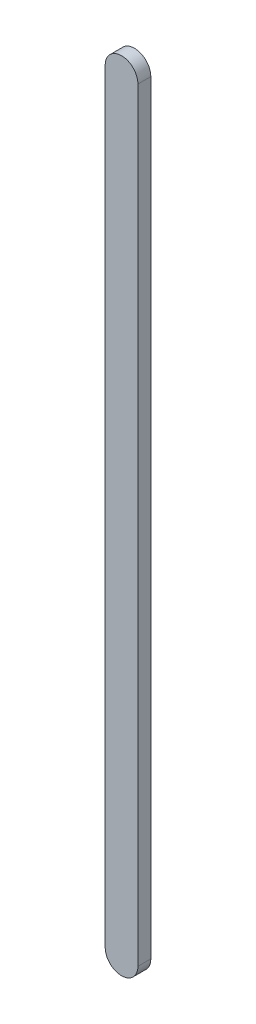
ISO-10303-21;
HEADER;
FILE_DESCRIPTION(('STEP AP214'),'2;1');
FILE_NAME('part.step','',(''),(''),'','','');
FILE_SCHEMA(('AUTOMOTIVE_DESIGN { 1 0 10303 214 1 1 1 1 }'));
ENDSEC;
DATA;
#1=APPLICATION_CONTEXT('core data for automotive mechanical design processes');
#2=APPLICATION_PROTOCOL_DEFINITION('international standard','automotive_design',2000,#1);
#3=PRODUCT_CONTEXT('',#1,'mechanical');
#4=PRODUCT('Part','Part','',(#3));
#5=PRODUCT_RELATED_PRODUCT_CATEGORY('part','',(#4));
#6=PRODUCT_DEFINITION_FORMATION('','',#4);
#7=PRODUCT_DEFINITION_CONTEXT('part definition',#1,'design');
#8=PRODUCT_DEFINITION('design','',#6,#7);
#9=PRODUCT_DEFINITION_SHAPE('','',#8);
#10=(LENGTH_UNIT() NAMED_UNIT(*) SI_UNIT(.MILLI.,.METRE.));
#11=(NAMED_UNIT(*) PLANE_ANGLE_UNIT() SI_UNIT($,.RADIAN.));
#12=(NAMED_UNIT(*) SI_UNIT($,.STERADIAN.) SOLID_ANGLE_UNIT());
#13=UNCERTAINTY_MEASURE_WITH_UNIT(LENGTH_MEASURE(1.E-05),#10,'distance_accuracy_value','');
#14=(GEOMETRIC_REPRESENTATION_CONTEXT(3) GLOBAL_UNCERTAINTY_ASSIGNED_CONTEXT((#13)) GLOBAL_UNIT_ASSIGNED_CONTEXT((#10,
#11,#12)) REPRESENTATION_CONTEXT('',''));
#15=CARTESIAN_POINT('',(0.,0.,0.));
#16=DIRECTION('',(0.,0.,1.));
#17=DIRECTION('',(1.,0.,0.));
#18=AXIS2_PLACEMENT_3D('',#15,#16,#17);
#19=CARTESIAN_POINT('',(143.51,85.3948,0.));
#20=DIRECTION('',(-1.,0.,0.));
#21=DIRECTION('',(0.,1.,0.));
#22=AXIS2_PLACEMENT_3D('',#19,#20,#21);
#23=PLANE('',#22);
#24=DIRECTION('',(0.,1.,0.));
#25=VECTOR('',#24,1.);
#26=CARTESIAN_POINT('',(143.51,85.3948,0.1999996));
#27=LINE('',#26,#25);
#28=CARTESIAN_POINT('',(143.51,85.3948,0.1999996));
#29=VERTEX_POINT('',#28);
#30=CARTESIAN_POINT('',(143.51,97.2519264,0.1999996));
#31=VERTEX_POINT('',#30);
#32=EDGE_CURVE('E11',#29,#31,#27,.T.);
#33=ORIENTED_EDGE('',*,*,#32,.F.);
#34=DIRECTION('',(0.,0.,1.));
#35=VECTOR('',#34,1.);
#36=CARTESIAN_POINT('',(143.51,85.3948,0.));
#37=LINE('',#36,#35);
#38=CARTESIAN_POINT('',(143.51,85.3948,0.));
#39=VERTEX_POINT('',#38);
#40=EDGE_CURVE('E24',#39,#29,#37,.T.);
#41=ORIENTED_EDGE('',*,*,#40,.F.);
#42=DIRECTION('',(0.,1.,0.));
#43=VECTOR('',#42,1.);
#44=CARTESIAN_POINT('',(143.51,85.3948,0.));
#45=LINE('',#44,#43);
#46=CARTESIAN_POINT('',(143.51,97.2519264,0.));
#47=VERTEX_POINT('',#46);
#48=EDGE_CURVE('E75',#39,#47,#45,.T.);
#49=ORIENTED_EDGE('',*,*,#48,.T.);
#50=DIRECTION('',(0.,0.,1.));
#51=VECTOR('',#50,1.);
#52=CARTESIAN_POINT('',(143.51,97.2519264,0.));
#53=LINE('',#52,#51);
#54=EDGE_CURVE('E37',#47,#31,#53,.T.);
#55=ORIENTED_EDGE('',*,*,#54,.T.);
#56=EDGE_LOOP('',(#33,#41,#49,#55));
#57=FACE_BOUND('',#56,.T.);
#58=ADVANCED_FACE('F17',(#57),#23,.F.);
#59=CARTESIAN_POINT('',(143.256,97.2519264,0.));
#60=DIRECTION('',(0.,0.,-1.));
#61=DIRECTION('',(1.,0.,0.));
#62=AXIS2_PLACEMENT_3D('',#59,#60,#61);
#63=CYLINDRICAL_SURFACE('',#62,0.253999999999986);
#64=CARTESIAN_POINT('',(143.256,97.2519264,0.1999996));
#65=DIRECTION('',(0.,0.,1.));
#66=DIRECTION('',(1.,0.,0.));
#67=AXIS2_PLACEMENT_3D('',#64,#65,#66);
#68=CIRCLE('',#67,0.253999999999986);
#69=CARTESIAN_POINT('',(143.002,97.2519264,0.1999996));
#70=VERTEX_POINT('',#69);
#71=EDGE_CURVE('E83',#31,#70,#68,.T.);
#72=ORIENTED_EDGE('',*,*,#71,.F.);
#73=ORIENTED_EDGE('',*,*,#54,.F.);
#74=CARTESIAN_POINT('',(143.256,97.2519264,0.));
#75=DIRECTION('',(0.,0.,1.));
#76=DIRECTION('',(1.,0.,0.));
#77=AXIS2_PLACEMENT_3D('',#74,#75,#76);
#78=CIRCLE('',#77,0.253999999999986);
#79=CARTESIAN_POINT('',(143.002,97.2519264,0.));
#80=VERTEX_POINT('',#79);
#81=EDGE_CURVE('E81',#47,#80,#78,.T.);
#82=ORIENTED_EDGE('',*,*,#81,.T.);
#83=DIRECTION('',(0.,0.,1.));
#84=VECTOR('',#83,1.);
#85=CARTESIAN_POINT('',(143.002,97.2519264,0.));
#86=LINE('',#85,#84);
#87=EDGE_CURVE('E67',#80,#70,#86,.T.);
#88=ORIENTED_EDGE('',*,*,#87,.T.);
#89=EDGE_LOOP('',(#72,#73,#82,#88));
#90=FACE_BOUND('',#89,.T.);
#91=ADVANCED_FACE('F89',(#90),#63,.T.);
#92=CARTESIAN_POINT('',(143.002,97.2519264,0.));
#93=DIRECTION('',(1.,0.,0.));
#94=DIRECTION('',(0.,-1.,0.));
#95=AXIS2_PLACEMENT_3D('',#92,#93,#94);
#96=PLANE('',#95);
#97=DIRECTION('',(0.,-1.,0.));
#98=VECTOR('',#97,1.);
#99=CARTESIAN_POINT('',(143.002,97.2519264,0.1999996));
#100=LINE('',#99,#98);
#101=CARTESIAN_POINT('',(143.002,85.3948,0.1999996));
#102=VERTEX_POINT('',#101);
#103=EDGE_CURVE('E71',#70,#102,#100,.T.);
#104=ORIENTED_EDGE('',*,*,#103,.F.);
#105=ORIENTED_EDGE('',*,*,#87,.F.);
#106=DIRECTION('',(0.,-1.,0.));
#107=VECTOR('',#106,1.);
#108=CARTESIAN_POINT('',(143.002,97.2519264,0.));
#109=LINE('',#108,#107);
#110=CARTESIAN_POINT('',(143.002,85.3948,0.));
#111=VERTEX_POINT('',#110);
#112=EDGE_CURVE('E63',#80,#111,#109,.T.);
#113=ORIENTED_EDGE('',*,*,#112,.T.);
#114=DIRECTION('',(0.,0.,1.));
#115=VECTOR('',#114,1.);
#116=CARTESIAN_POINT('',(143.002,85.3948,0.));
#117=LINE('',#116,#115);
#118=EDGE_CURVE('E53',#111,#102,#117,.T.);
#119=ORIENTED_EDGE('',*,*,#118,.T.);
#120=EDGE_LOOP('',(#104,#105,#113,#119));
#121=FACE_BOUND('',#120,.T.);
#122=ADVANCED_FACE('F66',(#121),#96,.F.);
#123=CARTESIAN_POINT('',(143.256,85.3948,0.));
#124=DIRECTION('',(0.,0.,-1.));
#125=DIRECTION('',(-1.,1.11896493820492E-13,0.));
#126=AXIS2_PLACEMENT_3D('',#123,#124,#125);
#127=CYLINDRICAL_SURFACE('',#126,0.253999999999986);
#128=CARTESIAN_POINT('',(143.256,85.3948,0.1999996));
#129=DIRECTION('',(0.,0.,1.));
#130=DIRECTION('',(-1.,1.11896493820492E-13,0.));
#131=AXIS2_PLACEMENT_3D('',#128,#129,#130);
#132=CIRCLE('',#131,0.253999999999986);
#133=EDGE_CURVE('E59',#102,#29,#132,.T.);
#134=ORIENTED_EDGE('',*,*,#133,.F.);
#135=ORIENTED_EDGE('',*,*,#118,.F.);
#136=CARTESIAN_POINT('',(143.256,85.3948,0.));
#137=DIRECTION('',(0.,0.,1.));
#138=DIRECTION('',(-1.,1.11896493820492E-13,0.));
#139=AXIS2_PLACEMENT_3D('',#136,#137,#138);
#140=CIRCLE('',#139,0.253999999999986);
#141=EDGE_CURVE('E57',#111,#39,#140,.T.);
#142=ORIENTED_EDGE('',*,*,#141,.T.);
#143=ORIENTED_EDGE('',*,*,#40,.T.);
#144=EDGE_LOOP('',(#134,#135,#142,#143));
#145=FACE_BOUND('',#144,.T.);
#146=ADVANCED_FACE('F55',(#145),#127,.T.);
#147=CARTESIAN_POINT('',(143.51,85.3948,0.));
#148=DIRECTION('',(0.,0.,-1.));
#149=DIRECTION('',(-1.,0.,0.));
#150=AXIS2_PLACEMENT_3D('',#147,#148,#149);
#151=PLANE('',#150);
#152=ORIENTED_EDGE('',*,*,#141,.F.);
#153=ORIENTED_EDGE('',*,*,#112,.F.);
#154=ORIENTED_EDGE('',*,*,#81,.F.);
#155=ORIENTED_EDGE('',*,*,#48,.F.);
#156=EDGE_LOOP('',(#152,#153,#154,#155));
#157=FACE_BOUND('',#156,.T.);
#158=ADVANCED_FACE('F74',(#157),#151,.T.);
#159=CARTESIAN_POINT('',(143.51,85.3948,0.1999996));
#160=DIRECTION('',(0.,0.,-1.));
#161=DIRECTION('',(-1.,0.,0.));
#162=AXIS2_PLACEMENT_3D('',#159,#160,#161);
#163=PLANE('',#162);
#164=ORIENTED_EDGE('',*,*,#32,.T.);
#165=ORIENTED_EDGE('',*,*,#71,.T.);
#166=ORIENTED_EDGE('',*,*,#103,.T.);
#167=ORIENTED_EDGE('',*,*,#133,.T.);
#168=EDGE_LOOP('',(#164,#165,#166,#167));
#169=FACE_BOUND('',#168,.T.);
#170=ADVANCED_FACE('F91',(#169),#163,.F.);
#171=CLOSED_SHELL('',(#58,#91,#122,#146,#158,#170));
#172=MANIFOLD_SOLID_BREP('B1',#171);
#173=ADVANCED_BREP_SHAPE_REPRESENTATION('',(#18,#172),#14);
#174=SHAPE_DEFINITION_REPRESENTATION(#9,#173);
ENDSEC;
END-ISO-10303-21;
